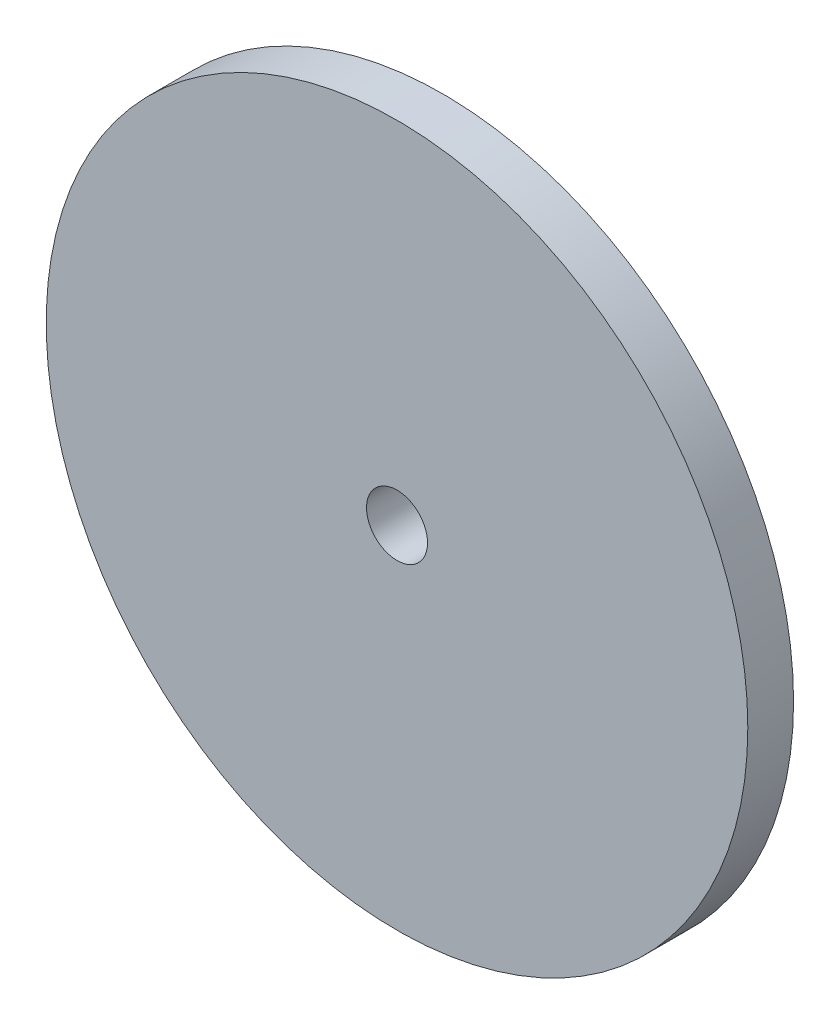
ISO-10303-21;
HEADER;
FILE_DESCRIPTION(('STEP AP214'),'2;1');
FILE_NAME('part.step','',(''),(''),'','','');
FILE_SCHEMA(('AUTOMOTIVE_DESIGN { 1 0 10303 214 1 1 1 1 }'));
ENDSEC;
DATA;
#1=APPLICATION_CONTEXT('core data for automotive mechanical design processes');
#2=APPLICATION_PROTOCOL_DEFINITION('international standard','automotive_design',2000,#1);
#3=PRODUCT_CONTEXT('',#1,'mechanical');
#4=PRODUCT('Part','Part','',(#3));
#5=PRODUCT_RELATED_PRODUCT_CATEGORY('part','',(#4));
#6=PRODUCT_DEFINITION_FORMATION('','',#4);
#7=PRODUCT_DEFINITION_CONTEXT('part definition',#1,'design');
#8=PRODUCT_DEFINITION('design','',#6,#7);
#9=PRODUCT_DEFINITION_SHAPE('','',#8);
#10=(LENGTH_UNIT() NAMED_UNIT(*) SI_UNIT(.MILLI.,.METRE.));
#11=(NAMED_UNIT(*) PLANE_ANGLE_UNIT() SI_UNIT($,.RADIAN.));
#12=(NAMED_UNIT(*) SI_UNIT($,.STERADIAN.) SOLID_ANGLE_UNIT());
#13=UNCERTAINTY_MEASURE_WITH_UNIT(LENGTH_MEASURE(1.E-05),#10,'distance_accuracy_value','');
#14=(GEOMETRIC_REPRESENTATION_CONTEXT(3) GLOBAL_UNCERTAINTY_ASSIGNED_CONTEXT((#13)) GLOBAL_UNIT_ASSIGNED_CONTEXT((#10,
#11,#12)) REPRESENTATION_CONTEXT('',''));
#15=CARTESIAN_POINT('',(0.,0.,0.));
#16=DIRECTION('',(0.,0.,1.));
#17=DIRECTION('',(1.,0.,0.));
#18=AXIS2_PLACEMENT_3D('',#15,#16,#17);
#19=CARTESIAN_POINT('',(11.5,0.,0.));
#20=DIRECTION('',(0.,0.,1.));
#21=DIRECTION('',(1.,0.,0.));
#22=AXIS2_PLACEMENT_3D('',#19,#20,#21);
#23=PLANE('',#22);
#24=CARTESIAN_POINT('',(0.,0.,0.));
#25=DIRECTION('',(0.,0.,1.));
#26=DIRECTION('',(1.,0.,0.));
#27=AXIS2_PLACEMENT_3D('',#24,#25,#26);
#28=CIRCLE('',#27,11.5);
#29=CARTESIAN_POINT('',(11.5,0.,0.));
#30=VERTEX_POINT('',#29);
#31=EDGE_CURVE('E53',#30,#30,#28,.T.);
#32=ORIENTED_EDGE('',*,*,#31,.T.);
#33=EDGE_LOOP('',(#32));
#34=FACE_BOUND('',#33,.T.);
#35=CARTESIAN_POINT('',(0.,0.,0.));
#36=DIRECTION('',(0.,0.,1.));
#37=DIRECTION('',(1.,0.,0.));
#38=AXIS2_PLACEMENT_3D('',#35,#36,#37);
#39=CIRCLE('',#38,1.);
#40=CARTESIAN_POINT('',(1.,0.,0.));
#41=VERTEX_POINT('',#40);
#42=EDGE_CURVE('E10',#41,#41,#39,.T.);
#43=ORIENTED_EDGE('',*,*,#42,.F.);
#44=EDGE_LOOP('',(#43));
#45=FACE_BOUND('',#44,.T.);
#46=ADVANCED_FACE('F31',(#34,#45),#23,.T.);
#47=CARTESIAN_POINT('',(0.,0.,0.));
#48=DIRECTION('',(0.,0.,1.));
#49=DIRECTION('',(1.,0.,0.));
#50=AXIS2_PLACEMENT_3D('',#47,#48,#49);
#51=CYLINDRICAL_SURFACE('',#50,1.);
#52=ORIENTED_EDGE('',*,*,#42,.T.);
#53=EDGE_LOOP('',(#52));
#54=FACE_BOUND('',#53,.T.);
#55=CARTESIAN_POINT('',(0.,0.,-6.));
#56=DIRECTION('',(0.,0.,1.));
#57=DIRECTION('',(1.,0.,0.));
#58=AXIS2_PLACEMENT_3D('',#55,#56,#57);
#59=CIRCLE('',#58,1.);
#60=CARTESIAN_POINT('',(1.,0.,-6.));
#61=VERTEX_POINT('',#60);
#62=EDGE_CURVE('E37',#61,#61,#59,.T.);
#63=ORIENTED_EDGE('',*,*,#62,.F.);
#64=EDGE_LOOP('',(#63));
#65=FACE_BOUND('',#64,.T.);
#66=ADVANCED_FACE('F71',(#54,#65),#51,.F.);
#67=CARTESIAN_POINT('',(1.,0.,-6.));
#68=DIRECTION('',(0.,0.,-1.));
#69=DIRECTION('',(-1.,0.,0.));
#70=AXIS2_PLACEMENT_3D('',#67,#68,#69);
#71=PLANE('',#70);
#72=ORIENTED_EDGE('',*,*,#62,.T.);
#73=EDGE_LOOP('',(#72));
#74=FACE_BOUND('',#73,.T.);
#75=CARTESIAN_POINT('',(0.,0.,-6.));
#76=DIRECTION('',(0.,0.,1.));
#77=DIRECTION('',(1.,0.,0.));
#78=AXIS2_PLACEMENT_3D('',#75,#76,#77);
#79=CIRCLE('',#78,2.4);
#80=CARTESIAN_POINT('',(2.4,0.,-6.));
#81=VERTEX_POINT('',#80);
#82=EDGE_CURVE('E41',#81,#81,#79,.T.);
#83=ORIENTED_EDGE('',*,*,#82,.F.);
#84=EDGE_LOOP('',(#83));
#85=FACE_BOUND('',#84,.T.);
#86=ADVANCED_FACE('F75',(#74,#85),#71,.T.);
#87=CARTESIAN_POINT('',(0.,0.,0.));
#88=DIRECTION('',(0.,0.,1.));
#89=DIRECTION('',(1.,0.,0.));
#90=AXIS2_PLACEMENT_3D('',#87,#88,#89);
#91=CYLINDRICAL_SURFACE('',#90,2.4);
#92=ORIENTED_EDGE('',*,*,#82,.T.);
#93=EDGE_LOOP('',(#92));
#94=FACE_BOUND('',#93,.T.);
#95=CARTESIAN_POINT('',(0.,0.,-1.5));
#96=DIRECTION('',(0.,0.,1.));
#97=DIRECTION('',(1.,0.,0.));
#98=AXIS2_PLACEMENT_3D('',#95,#96,#97);
#99=CIRCLE('',#98,2.4);
#100=CARTESIAN_POINT('',(2.4,0.,-1.5));
#101=VERTEX_POINT('',#100);
#102=EDGE_CURVE('E45',#101,#101,#99,.T.);
#103=ORIENTED_EDGE('',*,*,#102,.F.);
#104=EDGE_LOOP('',(#103));
#105=FACE_BOUND('',#104,.T.);
#106=ADVANCED_FACE('F67',(#94,#105),#91,.T.);
#107=CARTESIAN_POINT('',(2.4,0.,-1.5));
#108=DIRECTION('',(0.,0.,-1.));
#109=DIRECTION('',(-1.,0.,0.));
#110=AXIS2_PLACEMENT_3D('',#107,#108,#109);
#111=PLANE('',#110);
#112=ORIENTED_EDGE('',*,*,#102,.T.);
#113=EDGE_LOOP('',(#112));
#114=FACE_BOUND('',#113,.T.);
#115=CARTESIAN_POINT('',(0.,0.,-1.5));
#116=DIRECTION('',(0.,0.,1.));
#117=DIRECTION('',(1.,0.,0.));
#118=AXIS2_PLACEMENT_3D('',#115,#116,#117);
#119=CIRCLE('',#118,11.5);
#120=CARTESIAN_POINT('',(11.5,0.,-1.5));
#121=VERTEX_POINT('',#120);
#122=EDGE_CURVE('E50',#121,#121,#119,.T.);
#123=ORIENTED_EDGE('',*,*,#122,.F.);
#124=EDGE_LOOP('',(#123));
#125=FACE_BOUND('',#124,.T.);
#126=ADVANCED_FACE('F61',(#114,#125),#111,.T.);
#127=CARTESIAN_POINT('',(0.,0.,0.));
#128=DIRECTION('',(0.,0.,1.));
#129=DIRECTION('',(1.,0.,0.));
#130=AXIS2_PLACEMENT_3D('',#127,#128,#129);
#131=CYLINDRICAL_SURFACE('',#130,11.5);
#132=ORIENTED_EDGE('',*,*,#122,.T.);
#133=EDGE_LOOP('',(#132));
#134=FACE_BOUND('',#133,.T.);
#135=ORIENTED_EDGE('',*,*,#31,.F.);
#136=EDGE_LOOP('',(#135));
#137=FACE_BOUND('',#136,.T.);
#138=ADVANCED_FACE('F59',(#134,#137),#131,.T.);
#139=CLOSED_SHELL('',(#46,#66,#86,#106,#126,#138));
#140=MANIFOLD_SOLID_BREP('B2',#139);
#141=ADVANCED_BREP_SHAPE_REPRESENTATION('',(#18,#140),#14);
#142=SHAPE_DEFINITION_REPRESENTATION(#9,#141);
ENDSEC;
END-ISO-10303-21;
